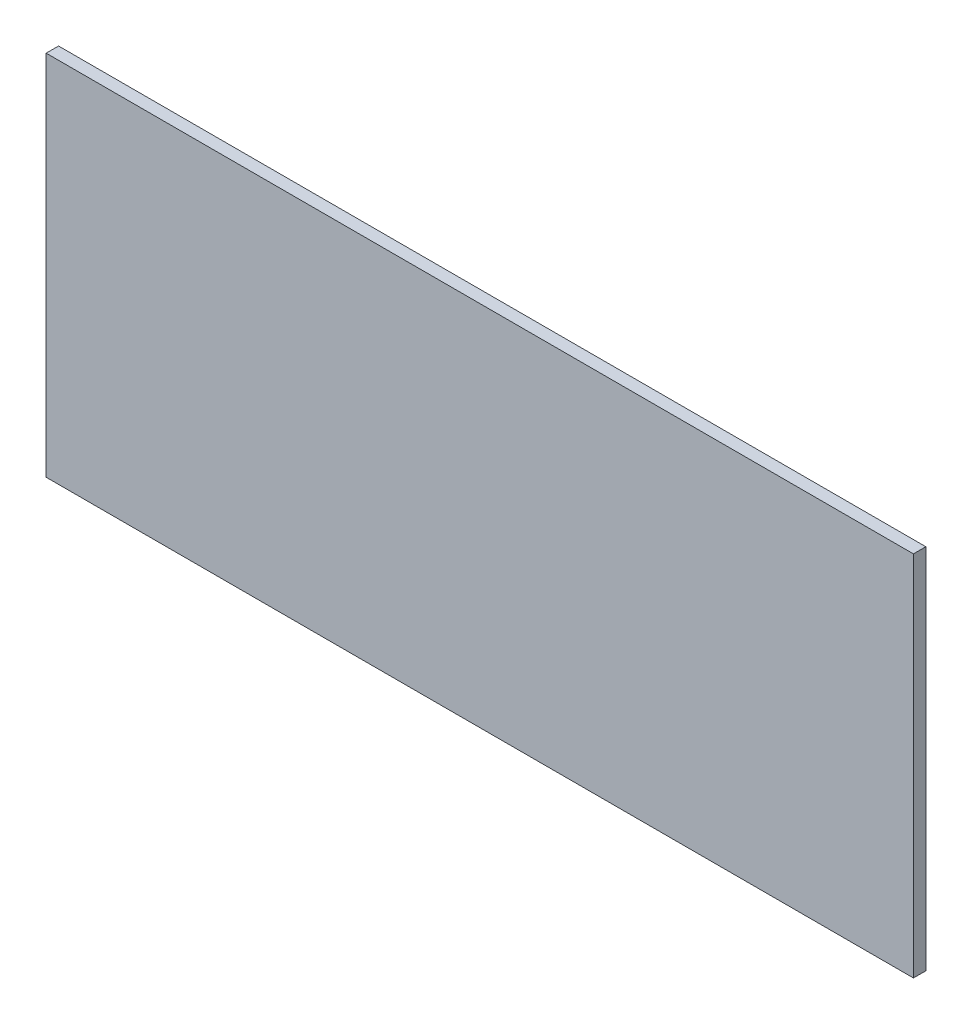
ISO-10303-21;
HEADER;
FILE_DESCRIPTION(('STEP AP214'),'2;1');
FILE_NAME('part.step','',(''),(''),'','','');
FILE_SCHEMA(('AUTOMOTIVE_DESIGN { 1 0 10303 214 1 1 1 1 }'));
ENDSEC;
DATA;
#1=APPLICATION_CONTEXT('core data for automotive mechanical design processes');
#2=APPLICATION_PROTOCOL_DEFINITION('international standard','automotive_design',2000,#1);
#3=PRODUCT_CONTEXT('',#1,'mechanical');
#4=PRODUCT('Part','Part','',(#3));
#5=PRODUCT_RELATED_PRODUCT_CATEGORY('part','',(#4));
#6=PRODUCT_DEFINITION_FORMATION('','',#4);
#7=PRODUCT_DEFINITION_CONTEXT('part definition',#1,'design');
#8=PRODUCT_DEFINITION('design','',#6,#7);
#9=PRODUCT_DEFINITION_SHAPE('','',#8);
#10=(LENGTH_UNIT() NAMED_UNIT(*) SI_UNIT(.MILLI.,.METRE.));
#11=(NAMED_UNIT(*) PLANE_ANGLE_UNIT() SI_UNIT($,.RADIAN.));
#12=(NAMED_UNIT(*) SI_UNIT($,.STERADIAN.) SOLID_ANGLE_UNIT());
#13=UNCERTAINTY_MEASURE_WITH_UNIT(LENGTH_MEASURE(1.E-05),#10,'distance_accuracy_value','');
#14=(GEOMETRIC_REPRESENTATION_CONTEXT(3) GLOBAL_UNCERTAINTY_ASSIGNED_CONTEXT((#13)) GLOBAL_UNIT_ASSIGNED_CONTEXT((#10,
#11,#12)) REPRESENTATION_CONTEXT('',''));
#15=CARTESIAN_POINT('',(0.,0.,0.));
#16=DIRECTION('',(0.,0.,1.));
#17=DIRECTION('',(1.,0.,0.));
#18=AXIS2_PLACEMENT_3D('',#15,#16,#17);
#19=CARTESIAN_POINT('',(104.9528,-44.45,3.));
#20=DIRECTION('',(-1.,0.,0.));
#21=DIRECTION('',(0.,0.,1.));
#22=AXIS2_PLACEMENT_3D('',#19,#20,#21);
#23=PLANE('',#22);
#24=DIRECTION('',(0.,1.,0.));
#25=VECTOR('',#24,1.);
#26=CARTESIAN_POINT('',(104.9528,-44.45,0.));
#27=LINE('',#26,#25);
#28=CARTESIAN_POINT('',(104.9528,-44.45,0.));
#29=VERTEX_POINT('',#28);
#30=CARTESIAN_POINT('',(104.9528,44.45,0.));
#31=VERTEX_POINT('',#30);
#32=EDGE_CURVE('E105',#29,#31,#27,.T.);
#33=ORIENTED_EDGE('',*,*,#32,.T.);
#34=DIRECTION('',(0.,0.,-1.));
#35=VECTOR('',#34,1.);
#36=CARTESIAN_POINT('',(104.9528,44.45,3.));
#37=LINE('',#36,#35);
#38=CARTESIAN_POINT('',(104.9528,44.45,3.));
#39=VERTEX_POINT('',#38);
#40=EDGE_CURVE('E11',#39,#31,#37,.T.);
#41=ORIENTED_EDGE('',*,*,#40,.F.);
#42=DIRECTION('',(0.,1.,0.));
#43=VECTOR('',#42,1.);
#44=CARTESIAN_POINT('',(104.9528,-44.45,3.));
#45=LINE('',#44,#43);
#46=CARTESIAN_POINT('',(104.9528,-44.45,3.));
#47=VERTEX_POINT('',#46);
#48=EDGE_CURVE('E89',#47,#39,#45,.T.);
#49=ORIENTED_EDGE('',*,*,#48,.F.);
#50=DIRECTION('',(0.,0.,-1.));
#51=VECTOR('',#50,1.);
#52=CARTESIAN_POINT('',(104.9528,-44.45,3.));
#53=LINE('',#52,#51);
#54=EDGE_CURVE('E98',#47,#29,#53,.T.);
#55=ORIENTED_EDGE('',*,*,#54,.T.);
#56=EDGE_LOOP('',(#33,#41,#49,#55));
#57=FACE_BOUND('',#56,.T.);
#58=ADVANCED_FACE('F39',(#57),#23,.F.);
#59=CARTESIAN_POINT('',(-104.9528,44.45,3.));
#60=DIRECTION('',(0.,-1.,0.));
#61=DIRECTION('',(0.,0.,-1.));
#62=AXIS2_PLACEMENT_3D('',#59,#60,#61);
#63=PLANE('',#62);
#64=DIRECTION('',(-1.,0.,0.));
#65=VECTOR('',#64,1.);
#66=CARTESIAN_POINT('',(-104.9528,44.45,0.));
#67=LINE('',#66,#65);
#68=CARTESIAN_POINT('',(-104.9528,44.45,0.));
#69=VERTEX_POINT('',#68);
#70=EDGE_CURVE('E94',#31,#69,#67,.T.);
#71=ORIENTED_EDGE('',*,*,#70,.T.);
#72=DIRECTION('',(0.,0.,-1.));
#73=VECTOR('',#72,1.);
#74=CARTESIAN_POINT('',(-104.9528,44.45,3.));
#75=LINE('',#74,#73);
#76=CARTESIAN_POINT('',(-104.9528,44.45,3.));
#77=VERTEX_POINT('',#76);
#78=EDGE_CURVE('E50',#77,#69,#75,.T.);
#79=ORIENTED_EDGE('',*,*,#78,.F.);
#80=DIRECTION('',(-1.,0.,0.));
#81=VECTOR('',#80,1.);
#82=CARTESIAN_POINT('',(-104.9528,44.45,3.));
#83=LINE('',#82,#81);
#84=EDGE_CURVE('E83',#39,#77,#83,.T.);
#85=ORIENTED_EDGE('',*,*,#84,.F.);
#86=ORIENTED_EDGE('',*,*,#40,.T.);
#87=EDGE_LOOP('',(#71,#79,#85,#86));
#88=FACE_BOUND('',#87,.T.);
#89=ADVANCED_FACE('F91',(#88),#63,.F.);
#90=CARTESIAN_POINT('',(-104.9528,-44.45,3.));
#91=DIRECTION('',(1.,0.,0.));
#92=DIRECTION('',(0.,0.,-1.));
#93=AXIS2_PLACEMENT_3D('',#90,#91,#92);
#94=PLANE('',#93);
#95=DIRECTION('',(0.,-1.,0.));
#96=VECTOR('',#95,1.);
#97=CARTESIAN_POINT('',(-104.9528,-44.45,0.));
#98=LINE('',#97,#96);
#99=CARTESIAN_POINT('',(-104.9528,-44.45,0.));
#100=VERTEX_POINT('',#99);
#101=EDGE_CURVE('E75',#69,#100,#98,.T.);
#102=ORIENTED_EDGE('',*,*,#101,.T.);
#103=DIRECTION('',(0.,0.,-1.));
#104=VECTOR('',#103,1.);
#105=CARTESIAN_POINT('',(-104.9528,-44.45,3.));
#106=LINE('',#105,#104);
#107=CARTESIAN_POINT('',(-104.9528,-44.45,3.));
#108=VERTEX_POINT('',#107);
#109=EDGE_CURVE('E92',#108,#100,#106,.T.);
#110=ORIENTED_EDGE('',*,*,#109,.F.);
#111=DIRECTION('',(0.,-1.,0.));
#112=VECTOR('',#111,1.);
#113=CARTESIAN_POINT('',(-104.9528,-44.45,3.));
#114=LINE('',#113,#112);
#115=EDGE_CURVE('E86',#77,#108,#114,.T.);
#116=ORIENTED_EDGE('',*,*,#115,.F.);
#117=ORIENTED_EDGE('',*,*,#78,.T.);
#118=EDGE_LOOP('',(#102,#110,#116,#117));
#119=FACE_BOUND('',#118,.T.);
#120=ADVANCED_FACE('F96',(#119),#94,.F.);
#121=CARTESIAN_POINT('',(-104.9528,-44.45,3.));
#122=DIRECTION('',(0.,1.,0.));
#123=DIRECTION('',(0.,0.,1.));
#124=AXIS2_PLACEMENT_3D('',#121,#122,#123);
#125=PLANE('',#124);
#126=DIRECTION('',(1.,0.,0.));
#127=VECTOR('',#126,1.);
#128=CARTESIAN_POINT('',(-104.9528,-44.45,0.));
#129=LINE('',#128,#127);
#130=EDGE_CURVE('E79',#100,#29,#129,.T.);
#131=ORIENTED_EDGE('',*,*,#130,.T.);
#132=ORIENTED_EDGE('',*,*,#54,.F.);
#133=DIRECTION('',(1.,0.,0.));
#134=VECTOR('',#133,1.);
#135=CARTESIAN_POINT('',(-104.9528,-44.45,3.));
#136=LINE('',#135,#134);
#137=EDGE_CURVE('E54',#108,#47,#136,.T.);
#138=ORIENTED_EDGE('',*,*,#137,.F.);
#139=ORIENTED_EDGE('',*,*,#109,.T.);
#140=EDGE_LOOP('',(#131,#132,#138,#139));
#141=FACE_BOUND('',#140,.T.);
#142=ADVANCED_FACE('F108',(#141),#125,.F.);
#143=CARTESIAN_POINT('',(0.,0.,3.));
#144=DIRECTION('',(0.,0.,-1.));
#145=DIRECTION('',(-1.,0.,0.));
#146=AXIS2_PLACEMENT_3D('',#143,#144,#145);
#147=PLANE('',#146);
#148=ORIENTED_EDGE('',*,*,#48,.T.);
#149=ORIENTED_EDGE('',*,*,#84,.T.);
#150=ORIENTED_EDGE('',*,*,#115,.T.);
#151=ORIENTED_EDGE('',*,*,#137,.T.);
#152=EDGE_LOOP('',(#148,#149,#150,#151));
#153=FACE_BOUND('',#152,.T.);
#154=ADVANCED_FACE('F88',(#153),#147,.F.);
#155=CARTESIAN_POINT('',(0.,0.,0.));
#156=DIRECTION('',(0.,0.,-1.));
#157=DIRECTION('',(-1.,0.,0.));
#158=AXIS2_PLACEMENT_3D('',#155,#156,#157);
#159=PLANE('',#158);
#160=ORIENTED_EDGE('',*,*,#32,.F.);
#161=ORIENTED_EDGE('',*,*,#130,.F.);
#162=ORIENTED_EDGE('',*,*,#101,.F.);
#163=ORIENTED_EDGE('',*,*,#70,.F.);
#164=EDGE_LOOP('',(#160,#161,#162,#163));
#165=FACE_BOUND('',#164,.T.);
#166=ADVANCED_FACE('F115',(#165),#159,.T.);
#167=CLOSED_SHELL('',(#58,#89,#120,#142,#154,#166));
#168=MANIFOLD_SOLID_BREP('B2',#167);
#169=ADVANCED_BREP_SHAPE_REPRESENTATION('',(#18,#168),#14);
#170=SHAPE_DEFINITION_REPRESENTATION(#9,#169);
ENDSEC;
END-ISO-10303-21;
